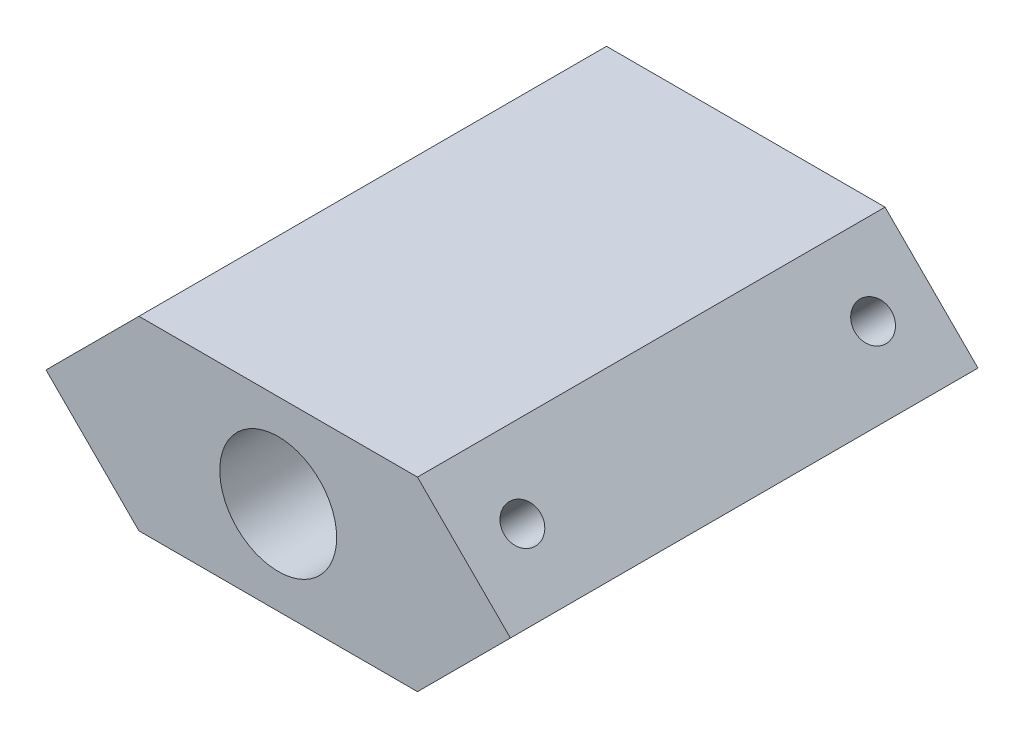
ISO-10303-21;
HEADER;
FILE_DESCRIPTION(('STEP AP214'),'2;1');
FILE_NAME('part.step','',(''),(''),'','','');
FILE_SCHEMA(('AUTOMOTIVE_DESIGN { 1 0 10303 214 1 1 1 1 }'));
ENDSEC;
DATA;
#1=APPLICATION_CONTEXT('core data for automotive mechanical design processes');
#2=APPLICATION_PROTOCOL_DEFINITION('international standard','automotive_design',2000,#1);
#3=PRODUCT_CONTEXT('',#1,'mechanical');
#4=PRODUCT('Part','Part','',(#3));
#5=PRODUCT_RELATED_PRODUCT_CATEGORY('part','',(#4));
#6=PRODUCT_DEFINITION_FORMATION('','',#4);
#7=PRODUCT_DEFINITION_CONTEXT('part definition',#1,'design');
#8=PRODUCT_DEFINITION('design','',#6,#7);
#9=PRODUCT_DEFINITION_SHAPE('','',#8);
#10=(LENGTH_UNIT() NAMED_UNIT(*) SI_UNIT(.MILLI.,.METRE.));
#11=(NAMED_UNIT(*) PLANE_ANGLE_UNIT() SI_UNIT($,.RADIAN.));
#12=(NAMED_UNIT(*) SI_UNIT($,.STERADIAN.) SOLID_ANGLE_UNIT());
#13=UNCERTAINTY_MEASURE_WITH_UNIT(LENGTH_MEASURE(1.E-05),#10,'distance_accuracy_value','');
#14=(GEOMETRIC_REPRESENTATION_CONTEXT(3) GLOBAL_UNCERTAINTY_ASSIGNED_CONTEXT((#13)) GLOBAL_UNIT_ASSIGNED_CONTEXT((#10,
#11,#12)) REPRESENTATION_CONTEXT('',''));
#15=CARTESIAN_POINT('',(0.,0.,0.));
#16=DIRECTION('',(0.,0.,1.));
#17=DIRECTION('',(1.,0.,0.));
#18=AXIS2_PLACEMENT_3D('',#15,#16,#17);
#19=CARTESIAN_POINT('',(50.455,20.193,101.6));
#20=DIRECTION('',(0.,0.,-1.));
#21=DIRECTION('',(-1.,0.,0.));
#22=AXIS2_PLACEMENT_3D('',#19,#20,#21);
#23=CYLINDRICAL_SURFACE('',#22,6.35);
#24=CARTESIAN_POINT('',(50.455,20.193,7.35));
#25=DIRECTION('',(0.,0.,-1.));
#26=DIRECTION('',(-1.,0.,0.));
#27=AXIS2_PLACEMENT_3D('',#24,#25,#26);
#28=CIRCLE('',#27,6.35);
#29=CARTESIAN_POINT('',(44.105,20.193,7.35));
#30=VERTEX_POINT('',#29);
#31=EDGE_CURVE('E136',#30,#30,#28,.F.);
#32=ORIENTED_EDGE('',*,*,#31,.F.);
#33=EDGE_LOOP('',(#32));
#34=FACE_BOUND('',#33,.T.);
#35=CARTESIAN_POINT('',(50.455,20.193,80.95));
#36=DIRECTION('',(0.,0.,1.));
#37=DIRECTION('',(1.,0.,0.));
#38=AXIS2_PLACEMENT_3D('',#35,#36,#37);
#39=CIRCLE('',#38,6.35);
#40=CARTESIAN_POINT('',(56.805,20.193,80.95));
#41=VERTEX_POINT('',#40);
#42=EDGE_CURVE('E36',#41,#41,#39,.F.);
#43=ORIENTED_EDGE('',*,*,#42,.F.);
#44=EDGE_LOOP('',(#43));
#45=FACE_BOUND('',#44,.T.);
#46=ADVANCED_FACE('F32',(#34,#45),#23,.F.);
#47=CARTESIAN_POINT('',(0.,0.,101.6));
#48=DIRECTION('',(0.,1.,0.));
#49=DIRECTION('',(0.,0.,1.));
#50=AXIS2_PLACEMENT_3D('',#47,#48,#49);
#51=PLANE('',#50);
#52=DIRECTION('',(1.,0.,0.));
#53=VECTOR('',#52,1.);
#54=CARTESIAN_POINT('',(0.,0.,101.6));
#55=LINE('',#54,#53);
#56=CARTESIAN_POINT('',(20.193,0.,101.6));
#57=VERTEX_POINT('',#56);
#58=CARTESIAN_POINT('',(80.717,0.,101.6));
#59=VERTEX_POINT('',#58);
#60=EDGE_CURVE('E41',#57,#59,#55,.T.);
#61=ORIENTED_EDGE('',*,*,#60,.F.);
#62=DIRECTION('',(0.,0.,-1.));
#63=VECTOR('',#62,1.);
#64=CARTESIAN_POINT('',(20.193,0.,101.6));
#65=LINE('',#64,#63);
#66=CARTESIAN_POINT('',(20.193,0.,0.));
#67=VERTEX_POINT('',#66);
#68=EDGE_CURVE('E123',#57,#67,#65,.T.);
#69=ORIENTED_EDGE('',*,*,#68,.T.);
#70=DIRECTION('',(1.,0.,0.));
#71=VECTOR('',#70,1.);
#72=CARTESIAN_POINT('',(0.,0.,0.));
#73=LINE('',#72,#71);
#74=CARTESIAN_POINT('',(80.717,0.,0.));
#75=VERTEX_POINT('',#74);
#76=EDGE_CURVE('E57',#67,#75,#73,.T.);
#77=ORIENTED_EDGE('',*,*,#76,.T.);
#78=DIRECTION('',(0.,0.,-1.));
#79=VECTOR('',#78,1.);
#80=CARTESIAN_POINT('',(80.717,0.,101.6));
#81=LINE('',#80,#79);
#82=EDGE_CURVE('E128',#59,#75,#81,.T.);
#83=ORIENTED_EDGE('',*,*,#82,.F.);
#84=EDGE_LOOP('',(#61,#69,#77,#83));
#85=FACE_BOUND('',#84,.T.);
#86=ADVANCED_FACE('F34',(#85),#51,.F.);
#87=CARTESIAN_POINT('',(0.,40.386,101.6));
#88=DIRECTION('',(0.,-1.,0.));
#89=DIRECTION('',(0.,0.,-1.));
#90=AXIS2_PLACEMENT_3D('',#87,#88,#89);
#91=PLANE('',#90);
#92=DIRECTION('',(-1.,0.,0.));
#93=VECTOR('',#92,1.);
#94=CARTESIAN_POINT('',(0.,40.386,0.));
#95=LINE('',#94,#93);
#96=CARTESIAN_POINT('',(80.717,40.386,0.));
#97=VERTEX_POINT('',#96);
#98=CARTESIAN_POINT('',(20.1929999999999,40.386,0.));
#99=VERTEX_POINT('',#98);
#100=EDGE_CURVE('E102',#97,#99,#95,.T.);
#101=ORIENTED_EDGE('',*,*,#100,.T.);
#102=DIRECTION('',(0.,0.,-1.));
#103=VECTOR('',#102,1.);
#104=CARTESIAN_POINT('',(20.1929999999999,40.386,101.6));
#105=LINE('',#104,#103);
#106=CARTESIAN_POINT('',(20.1929999999999,40.386,101.6));
#107=VERTEX_POINT('',#106);
#108=EDGE_CURVE('E90',#107,#99,#105,.T.);
#109=ORIENTED_EDGE('',*,*,#108,.F.);
#110=DIRECTION('',(-1.,0.,0.));
#111=VECTOR('',#110,1.);
#112=CARTESIAN_POINT('',(0.,40.386,101.6));
#113=LINE('',#112,#111);
#114=CARTESIAN_POINT('',(80.717,40.386,101.6));
#115=VERTEX_POINT('',#114);
#116=EDGE_CURVE('E11',#115,#107,#113,.T.);
#117=ORIENTED_EDGE('',*,*,#116,.F.);
#118=DIRECTION('',(0.,0.,-1.));
#119=VECTOR('',#118,1.);
#120=CARTESIAN_POINT('',(80.717,40.386,101.6));
#121=LINE('',#120,#119);
#122=EDGE_CURVE('E113',#115,#97,#121,.T.);
#123=ORIENTED_EDGE('',*,*,#122,.T.);
#124=EDGE_LOOP('',(#101,#109,#117,#123));
#125=FACE_BOUND('',#124,.T.);
#126=ADVANCED_FACE('F99',(#125),#91,.F.);
#127=CARTESIAN_POINT('',(0.,40.386,101.6));
#128=DIRECTION('',(0.,0.,-1.));
#129=DIRECTION('',(-1.,0.,0.));
#130=AXIS2_PLACEMENT_3D('',#127,#128,#129);
#131=PLANE('',#130);
#132=CARTESIAN_POINT('',(50.455,20.193,101.6));
#133=DIRECTION('',(0.,0.,1.));
#134=DIRECTION('',(1.,0.,0.));
#135=AXIS2_PLACEMENT_3D('',#132,#133,#134);
#136=CIRCLE('',#135,12.7);
#137=CARTESIAN_POINT('',(63.155,20.193,101.6));
#138=VERTEX_POINT('',#137);
#139=EDGE_CURVE('E153',#138,#138,#136,.T.);
#140=ORIENTED_EDGE('',*,*,#139,.F.);
#141=EDGE_LOOP('',(#140));
#142=FACE_BOUND('',#141,.T.);
#143=ORIENTED_EDGE('',*,*,#116,.T.);
#144=DIRECTION('',(-0.707106781186546,-0.707106781186549,0.));
#145=VECTOR('',#144,1.);
#146=CARTESIAN_POINT('',(0.,20.193,101.6));
#147=LINE('',#146,#145);
#148=CARTESIAN_POINT('',(0.,20.193,101.6));
#149=VERTEX_POINT('',#148);
#150=EDGE_CURVE('E87',#107,#149,#147,.T.);
#151=ORIENTED_EDGE('',*,*,#150,.T.);
#152=DIRECTION('',(0.707106781186548,-0.707106781186547,0.));
#153=VECTOR('',#152,1.);
#154=CARTESIAN_POINT('',(0.,20.193,101.6));
#155=LINE('',#154,#153);
#156=EDGE_CURVE('E120',#149,#57,#155,.T.);
#157=ORIENTED_EDGE('',*,*,#156,.T.);
#158=ORIENTED_EDGE('',*,*,#60,.T.);
#159=DIRECTION('',(0.707106781186547,0.707106781186548,0.));
#160=VECTOR('',#159,1.);
#161=CARTESIAN_POINT('',(100.91,20.193,101.6));
#162=LINE('',#161,#160);
#163=CARTESIAN_POINT('',(100.91,20.193,101.6));
#164=VERTEX_POINT('',#163);
#165=EDGE_CURVE('E110',#59,#164,#162,.T.);
#166=ORIENTED_EDGE('',*,*,#165,.T.);
#167=DIRECTION('',(-0.707106781186548,0.707106781186547,0.));
#168=VECTOR('',#167,1.);
#169=CARTESIAN_POINT('',(100.91,20.193,101.6));
#170=LINE('',#169,#168);
#171=EDGE_CURVE('E108',#164,#115,#170,.T.);
#172=ORIENTED_EDGE('',*,*,#171,.T.);
#173=EDGE_LOOP('',(#143,#151,#157,#158,#166,#172));
#174=FACE_BOUND('',#173,.T.);
#175=ADVANCED_FACE('F106',(#142,#174),#131,.F.);
#176=CARTESIAN_POINT('',(0.,40.386,0.));
#177=DIRECTION('',(0.,0.,-1.));
#178=DIRECTION('',(-1.,0.,0.));
#179=AXIS2_PLACEMENT_3D('',#176,#177,#178);
#180=PLANE('',#179);
#181=CARTESIAN_POINT('',(50.455,20.193,0.));
#182=DIRECTION('',(0.,0.,-1.));
#183=DIRECTION('',(-1.,0.,0.));
#184=AXIS2_PLACEMENT_3D('',#181,#182,#183);
#185=CIRCLE('',#184,9.525);
#186=CARTESIAN_POINT('',(40.93,20.193,0.));
#187=VERTEX_POINT('',#186);
#188=EDGE_CURVE('E146',#187,#187,#185,.T.);
#189=ORIENTED_EDGE('',*,*,#188,.F.);
#190=EDGE_LOOP('',(#189));
#191=FACE_BOUND('',#190,.T.);
#192=DIRECTION('',(-0.707106781186546,-0.707106781186549,0.));
#193=VECTOR('',#192,1.);
#194=CARTESIAN_POINT('',(0.,20.193,0.));
#195=LINE('',#194,#193);
#196=CARTESIAN_POINT('',(0.,20.193,0.));
#197=VERTEX_POINT('',#196);
#198=EDGE_CURVE('E49',#99,#197,#195,.T.);
#199=ORIENTED_EDGE('',*,*,#198,.F.);
#200=ORIENTED_EDGE('',*,*,#100,.F.);
#201=DIRECTION('',(-0.707106781186548,0.707106781186547,0.));
#202=VECTOR('',#201,1.);
#203=CARTESIAN_POINT('',(100.91,20.193,0.));
#204=LINE('',#203,#202);
#205=CARTESIAN_POINT('',(100.91,20.193,0.));
#206=VERTEX_POINT('',#205);
#207=EDGE_CURVE('E103',#206,#97,#204,.T.);
#208=ORIENTED_EDGE('',*,*,#207,.F.);
#209=DIRECTION('',(0.707106781186547,0.707106781186548,0.));
#210=VECTOR('',#209,1.);
#211=CARTESIAN_POINT('',(100.91,20.193,0.));
#212=LINE('',#211,#210);
#213=EDGE_CURVE('E125',#75,#206,#212,.T.);
#214=ORIENTED_EDGE('',*,*,#213,.F.);
#215=ORIENTED_EDGE('',*,*,#76,.F.);
#216=DIRECTION('',(0.707106781186548,-0.707106781186547,0.));
#217=VECTOR('',#216,1.);
#218=CARTESIAN_POINT('',(0.,20.193,0.));
#219=LINE('',#218,#217);
#220=EDGE_CURVE('E115',#197,#67,#219,.T.);
#221=ORIENTED_EDGE('',*,*,#220,.F.);
#222=EDGE_LOOP('',(#199,#200,#208,#214,#215,#221));
#223=FACE_BOUND('',#222,.T.);
#224=ADVANCED_FACE('F211',(#191,#223),#180,.T.);
#225=CARTESIAN_POINT('',(100.91,20.193,101.6));
#226=DIRECTION('',(-0.707106781186548,0.707106781186547,0.));
#227=DIRECTION('',(-0.707106781186547,-0.707106781186548,0.));
#228=AXIS2_PLACEMENT_3D('',#225,#226,#227);
#229=PLANE('',#228);
#230=CARTESIAN_POINT('',(90.8135,10.0964999999999,31.75));
#231=DIRECTION('',(0.707106781186547,-0.707106781186548,0.));
#232=DIRECTION('',(0.707106781186548,0.707106781186547,0.));
#233=AXIS2_PLACEMENT_3D('',#230,#231,#232);
#234=CIRCLE('',#233,3.937);
#235=CARTESIAN_POINT('',(93.5973793975314,12.8803793975314,31.75));
#236=VERTEX_POINT('',#235);
#237=EDGE_CURVE('E138',#236,#236,#234,.T.);
#238=ORIENTED_EDGE('',*,*,#237,.F.);
#239=EDGE_LOOP('',(#238));
#240=FACE_BOUND('',#239,.T.);
#241=CARTESIAN_POINT('',(90.8135,10.0965,69.85));
#242=DIRECTION('',(0.707106781186547,-0.707106781186548,0.));
#243=DIRECTION('',(0.707106781186548,0.707106781186547,0.));
#244=AXIS2_PLACEMENT_3D('',#241,#242,#243);
#245=CIRCLE('',#244,3.937);
#246=CARTESIAN_POINT('',(93.5973793975315,12.8803793975314,69.85));
#247=VERTEX_POINT('',#246);
#248=EDGE_CURVE('E157',#247,#247,#245,.T.);
#249=ORIENTED_EDGE('',*,*,#248,.F.);
#250=EDGE_LOOP('',(#249));
#251=FACE_BOUND('',#250,.T.);
#252=ORIENTED_EDGE('',*,*,#213,.T.);
#253=DIRECTION('',(0.,0.,-1.));
#254=VECTOR('',#253,1.);
#255=CARTESIAN_POINT('',(100.91,20.193,101.6));
#256=LINE('',#255,#254);
#257=EDGE_CURVE('E131',#164,#206,#256,.T.);
#258=ORIENTED_EDGE('',*,*,#257,.F.);
#259=ORIENTED_EDGE('',*,*,#165,.F.);
#260=ORIENTED_EDGE('',*,*,#82,.T.);
#261=EDGE_LOOP('',(#252,#258,#259,#260));
#262=FACE_BOUND('',#261,.T.);
#263=ADVANCED_FACE('F216',(#240,#251,#262),#229,.F.);
#264=CARTESIAN_POINT('',(0.,20.193,101.6));
#265=DIRECTION('',(0.707106781186547,0.707106781186548,0.));
#266=DIRECTION('',(-0.707106781186548,0.707106781186547,0.));
#267=AXIS2_PLACEMENT_3D('',#264,#265,#266);
#268=PLANE('',#267);
#269=CARTESIAN_POINT('',(10.0965,10.0965,88.9));
#270=DIRECTION('',(-0.707106781186547,-0.707106781186548,0.));
#271=DIRECTION('',(0.707106781186548,-0.707106781186547,0.));
#272=AXIS2_PLACEMENT_3D('',#269,#270,#271);
#273=CIRCLE('',#272,3.937);
#274=CARTESIAN_POINT('',(12.8803793975314,7.31262060246857,88.9));
#275=VERTEX_POINT('',#274);
#276=EDGE_CURVE('E174',#275,#275,#273,.T.);
#277=ORIENTED_EDGE('',*,*,#276,.F.);
#278=EDGE_LOOP('',(#277));
#279=FACE_BOUND('',#278,.T.);
#280=CARTESIAN_POINT('',(10.0965,10.0965,12.7));
#281=DIRECTION('',(-0.707106781186547,-0.707106781186548,0.));
#282=DIRECTION('',(0.707106781186548,-0.707106781186547,0.));
#283=AXIS2_PLACEMENT_3D('',#280,#281,#282);
#284=CIRCLE('',#283,3.937);
#285=CARTESIAN_POINT('',(12.8803793975314,7.31262060246856,12.7));
#286=VERTEX_POINT('',#285);
#287=EDGE_CURVE('E180',#286,#286,#284,.T.);
#288=ORIENTED_EDGE('',*,*,#287,.F.);
#289=EDGE_LOOP('',(#288));
#290=FACE_BOUND('',#289,.T.);
#291=ORIENTED_EDGE('',*,*,#220,.T.);
#292=ORIENTED_EDGE('',*,*,#68,.F.);
#293=ORIENTED_EDGE('',*,*,#156,.F.);
#294=DIRECTION('',(0.,0.,-1.));
#295=VECTOR('',#294,1.);
#296=CARTESIAN_POINT('',(0.,20.193,101.6));
#297=LINE('',#296,#295);
#298=EDGE_CURVE('E91',#149,#197,#297,.T.);
#299=ORIENTED_EDGE('',*,*,#298,.T.);
#300=EDGE_LOOP('',(#291,#292,#293,#299));
#301=FACE_BOUND('',#300,.T.);
#302=ADVANCED_FACE('F205',(#279,#290,#301),#268,.F.);
#303=CARTESIAN_POINT('',(100.91,20.193,101.6));
#304=DIRECTION('',(-0.707106781186547,-0.707106781186548,0.));
#305=DIRECTION('',(0.707106781186548,-0.707106781186547,0.));
#306=AXIS2_PLACEMENT_3D('',#303,#304,#305);
#307=PLANE('',#306);
#308=CARTESIAN_POINT('',(90.8134999999999,30.2895,12.7));
#309=DIRECTION('',(0.707106781186549,0.707106781186546,0.));
#310=DIRECTION('',(-0.707106781186546,0.707106781186549,0.));
#311=AXIS2_PLACEMENT_3D('',#308,#309,#310);
#312=CIRCLE('',#311,3.975);
#313=CARTESIAN_POINT('',(88.0027505447834,33.1002494552165,12.7));
#314=VERTEX_POINT('',#313);
#315=EDGE_CURVE('E186',#314,#314,#312,.T.);
#316=ORIENTED_EDGE('',*,*,#315,.F.);
#317=EDGE_LOOP('',(#316));
#318=FACE_BOUND('',#317,.T.);
#319=CARTESIAN_POINT('',(90.8134999999999,30.2894999999999,88.9));
#320=DIRECTION('',(0.707106781186549,0.707106781186546,0.));
#321=DIRECTION('',(-0.707106781186546,0.707106781186549,0.));
#322=AXIS2_PLACEMENT_3D('',#319,#320,#321);
#323=CIRCLE('',#322,3.97500000000001);
#324=CARTESIAN_POINT('',(88.0027505447834,33.1002494552165,88.9));
#325=VERTEX_POINT('',#324);
#326=EDGE_CURVE('E192',#325,#325,#323,.T.);
#327=ORIENTED_EDGE('',*,*,#326,.F.);
#328=EDGE_LOOP('',(#327));
#329=FACE_BOUND('',#328,.T.);
#330=ORIENTED_EDGE('',*,*,#207,.T.);
#331=ORIENTED_EDGE('',*,*,#122,.F.);
#332=ORIENTED_EDGE('',*,*,#171,.F.);
#333=ORIENTED_EDGE('',*,*,#257,.T.);
#334=EDGE_LOOP('',(#330,#331,#332,#333));
#335=FACE_BOUND('',#334,.T.);
#336=ADVANCED_FACE('F203',(#318,#329,#335),#307,.F.);
#337=CARTESIAN_POINT('',(0.,20.193,101.6));
#338=DIRECTION('',(0.707106781186549,-0.707106781186546,0.));
#339=DIRECTION('',(0.707106781186546,0.707106781186549,0.));
#340=AXIS2_PLACEMENT_3D('',#337,#338,#339);
#341=PLANE('',#340);
#342=CARTESIAN_POINT('',(10.0965,30.2895,69.85));
#343=DIRECTION('',(-0.707106781186549,0.707106781186546,0.));
#344=DIRECTION('',(-0.707106781186546,-0.707106781186549,0.));
#345=AXIS2_PLACEMENT_3D('',#342,#343,#344);
#346=CIRCLE('',#345,3.937);
#347=CARTESIAN_POINT('',(7.31262060246854,27.5056206024686,69.85));
#348=VERTEX_POINT('',#347);
#349=EDGE_CURVE('E162',#348,#348,#346,.T.);
#350=ORIENTED_EDGE('',*,*,#349,.F.);
#351=EDGE_LOOP('',(#350));
#352=FACE_BOUND('',#351,.T.);
#353=CARTESIAN_POINT('',(10.0965,30.2895,31.75));
#354=DIRECTION('',(-0.707106781186549,0.707106781186546,0.));
#355=DIRECTION('',(-0.707106781186546,-0.707106781186549,0.));
#356=AXIS2_PLACEMENT_3D('',#353,#354,#355);
#357=CIRCLE('',#356,3.937);
#358=CARTESIAN_POINT('',(7.31262060246853,27.5056206024686,31.75));
#359=VERTEX_POINT('',#358);
#360=EDGE_CURVE('E168',#359,#359,#357,.T.);
#361=ORIENTED_EDGE('',*,*,#360,.F.);
#362=EDGE_LOOP('',(#361));
#363=FACE_BOUND('',#362,.T.);
#364=ORIENTED_EDGE('',*,*,#198,.T.);
#365=ORIENTED_EDGE('',*,*,#298,.F.);
#366=ORIENTED_EDGE('',*,*,#150,.F.);
#367=ORIENTED_EDGE('',*,*,#108,.T.);
#368=EDGE_LOOP('',(#364,#365,#366,#367));
#369=FACE_BOUND('',#368,.T.);
#370=ADVANCED_FACE('F89',(#352,#363,#369),#341,.F.);
#371=CARTESIAN_POINT('',(76.671364376269,16.147364376269,88.9));
#372=DIRECTION('',(0.707106781186549,0.707106781186546,0.));
#373=DIRECTION('',(-0.707106781186546,0.707106781186549,0.));
#374=AXIS2_PLACEMENT_3D('',#371,#372,#373);
#375=CYLINDRICAL_SURFACE('',#374,3.97500000000001);
#376=CARTESIAN_POINT('',(76.671364376269,16.147364376269,88.9));
#377=DIRECTION('',(0.707106781186549,0.707106781186546,0.));
#378=DIRECTION('',(-0.707106781186546,0.707106781186549,0.));
#379=AXIS2_PLACEMENT_3D('',#376,#377,#378);
#380=CIRCLE('',#379,3.97500000000001);
#381=CARTESIAN_POINT('',(73.8606149210524,18.9581138314856,88.9));
#382=VERTEX_POINT('',#381);
#383=EDGE_CURVE('E195',#382,#382,#380,.T.);
#384=ORIENTED_EDGE('',*,*,#383,.F.);
#385=EDGE_LOOP('',(#384));
#386=FACE_BOUND('',#385,.T.);
#387=ORIENTED_EDGE('',*,*,#326,.T.);
#388=EDGE_LOOP('',(#387));
#389=FACE_BOUND('',#388,.T.);
#390=ADVANCED_FACE('F201',(#386,#389),#375,.F.);
#391=CARTESIAN_POINT('',(76.671364376269,16.147364376269,88.9));
#392=DIRECTION('',(0.707106781186549,0.707106781186546,0.));
#393=DIRECTION('',(-0.707106781186546,0.707106781186549,0.));
#394=AXIS2_PLACEMENT_3D('',#391,#392,#393);
#395=PLANE('',#394);
#396=ORIENTED_EDGE('',*,*,#383,.T.);
#397=EDGE_LOOP('',(#396));
#398=FACE_BOUND('',#397,.T.);
#399=ADVANCED_FACE('F298',(#398),#395,.T.);
#400=CARTESIAN_POINT('',(76.671364376269,16.147364376269,12.7));
#401=DIRECTION('',(0.707106781186549,0.707106781186546,0.));
#402=DIRECTION('',(-0.707106781186546,0.707106781186549,0.));
#403=AXIS2_PLACEMENT_3D('',#400,#401,#402);
#404=CYLINDRICAL_SURFACE('',#403,3.975);
#405=CARTESIAN_POINT('',(76.671364376269,16.147364376269,12.7));
#406=DIRECTION('',(0.707106781186549,0.707106781186546,0.));
#407=DIRECTION('',(-0.707106781186546,0.707106781186549,0.));
#408=AXIS2_PLACEMENT_3D('',#405,#406,#407);
#409=CIRCLE('',#408,3.975);
#410=CARTESIAN_POINT('',(73.8606149210524,18.9581138314856,12.7));
#411=VERTEX_POINT('',#410);
#412=EDGE_CURVE('E189',#411,#411,#409,.T.);
#413=ORIENTED_EDGE('',*,*,#412,.F.);
#414=EDGE_LOOP('',(#413));
#415=FACE_BOUND('',#414,.T.);
#416=ORIENTED_EDGE('',*,*,#315,.T.);
#417=EDGE_LOOP('',(#416));
#418=FACE_BOUND('',#417,.T.);
#419=ADVANCED_FACE('F294',(#415,#418),#404,.F.);
#420=CARTESIAN_POINT('',(76.671364376269,16.147364376269,12.7));
#421=DIRECTION('',(0.707106781186549,0.707106781186546,0.));
#422=DIRECTION('',(-0.707106781186546,0.707106781186549,0.));
#423=AXIS2_PLACEMENT_3D('',#420,#421,#422);
#424=PLANE('',#423);
#425=ORIENTED_EDGE('',*,*,#412,.T.);
#426=EDGE_LOOP('',(#425));
#427=FACE_BOUND('',#426,.T.);
#428=ADVANCED_FACE('F290',(#427),#424,.T.);
#429=CARTESIAN_POINT('',(24.2386356237309,24.2386356237309,12.7));
#430=DIRECTION('',(-0.707106781186547,-0.707106781186548,0.));
#431=DIRECTION('',(0.707106781186548,-0.707106781186547,0.));
#432=AXIS2_PLACEMENT_3D('',#429,#430,#431);
#433=CYLINDRICAL_SURFACE('',#432,3.937);
#434=CARTESIAN_POINT('',(24.2386356237309,24.2386356237309,12.7));
#435=DIRECTION('',(-0.707106781186547,-0.707106781186548,0.));
#436=DIRECTION('',(0.707106781186548,-0.707106781186547,0.));
#437=AXIS2_PLACEMENT_3D('',#434,#435,#436);
#438=CIRCLE('',#437,3.937);
#439=CARTESIAN_POINT('',(27.0225150212624,21.4547562261995,12.7));
#440=VERTEX_POINT('',#439);
#441=EDGE_CURVE('E183',#440,#440,#438,.T.);
#442=ORIENTED_EDGE('',*,*,#441,.F.);
#443=EDGE_LOOP('',(#442));
#444=FACE_BOUND('',#443,.T.);
#445=ORIENTED_EDGE('',*,*,#287,.T.);
#446=EDGE_LOOP('',(#445));
#447=FACE_BOUND('',#446,.T.);
#448=ADVANCED_FACE('F286',(#444,#447),#433,.F.);
#449=CARTESIAN_POINT('',(24.2386356237309,24.2386356237309,12.7));
#450=DIRECTION('',(-0.707106781186547,-0.707106781186548,0.));
#451=DIRECTION('',(0.707106781186548,-0.707106781186547,0.));
#452=AXIS2_PLACEMENT_3D('',#449,#450,#451);
#453=PLANE('',#452);
#454=ORIENTED_EDGE('',*,*,#441,.T.);
#455=EDGE_LOOP('',(#454));
#456=FACE_BOUND('',#455,.T.);
#457=ADVANCED_FACE('F282',(#456),#453,.T.);
#458=CARTESIAN_POINT('',(24.2386356237309,24.238635623731,88.9));
#459=DIRECTION('',(-0.707106781186547,-0.707106781186548,0.));
#460=DIRECTION('',(0.707106781186548,-0.707106781186547,0.));
#461=AXIS2_PLACEMENT_3D('',#458,#459,#460);
#462=CYLINDRICAL_SURFACE('',#461,3.937);
#463=CARTESIAN_POINT('',(24.2386356237309,24.238635623731,88.9));
#464=DIRECTION('',(-0.707106781186547,-0.707106781186548,0.));
#465=DIRECTION('',(0.707106781186548,-0.707106781186547,0.));
#466=AXIS2_PLACEMENT_3D('',#463,#464,#465);
#467=CIRCLE('',#466,3.937);
#468=CARTESIAN_POINT('',(27.0225150212624,21.4547562261995,88.9));
#469=VERTEX_POINT('',#468);
#470=EDGE_CURVE('E177',#469,#469,#467,.T.);
#471=ORIENTED_EDGE('',*,*,#470,.F.);
#472=EDGE_LOOP('',(#471));
#473=FACE_BOUND('',#472,.T.);
#474=ORIENTED_EDGE('',*,*,#276,.T.);
#475=EDGE_LOOP('',(#474));
#476=FACE_BOUND('',#475,.T.);
#477=ADVANCED_FACE('F278',(#473,#476),#462,.F.);
#478=CARTESIAN_POINT('',(24.2386356237309,24.238635623731,88.9));
#479=DIRECTION('',(-0.707106781186547,-0.707106781186548,0.));
#480=DIRECTION('',(0.707106781186548,-0.707106781186547,0.));
#481=AXIS2_PLACEMENT_3D('',#478,#479,#480);
#482=PLANE('',#481);
#483=ORIENTED_EDGE('',*,*,#470,.T.);
#484=EDGE_LOOP('',(#483));
#485=FACE_BOUND('',#484,.T.);
#486=ADVANCED_FACE('F274',(#485),#482,.T.);
#487=CARTESIAN_POINT('',(24.2386356237309,16.1473643762691,31.75));
#488=DIRECTION('',(-0.707106781186549,0.707106781186546,0.));
#489=DIRECTION('',(-0.707106781186546,-0.707106781186549,0.));
#490=AXIS2_PLACEMENT_3D('',#487,#488,#489);
#491=CYLINDRICAL_SURFACE('',#490,3.937);
#492=CARTESIAN_POINT('',(24.2386356237309,16.1473643762691,31.75));
#493=DIRECTION('',(-0.707106781186549,0.707106781186546,0.));
#494=DIRECTION('',(-0.707106781186546,-0.707106781186549,0.));
#495=AXIS2_PLACEMENT_3D('',#492,#493,#494);
#496=CIRCLE('',#495,3.937);
#497=CARTESIAN_POINT('',(21.4547562261995,13.3634849787376,31.75));
#498=VERTEX_POINT('',#497);
#499=EDGE_CURVE('E171',#498,#498,#496,.T.);
#500=ORIENTED_EDGE('',*,*,#499,.F.);
#501=EDGE_LOOP('',(#500));
#502=FACE_BOUND('',#501,.T.);
#503=ORIENTED_EDGE('',*,*,#360,.T.);
#504=EDGE_LOOP('',(#503));
#505=FACE_BOUND('',#504,.T.);
#506=ADVANCED_FACE('F270',(#502,#505),#491,.F.);
#507=CARTESIAN_POINT('',(24.2386356237309,16.1473643762691,31.75));
#508=DIRECTION('',(-0.707106781186549,0.707106781186546,0.));
#509=DIRECTION('',(-0.707106781186546,-0.707106781186549,0.));
#510=AXIS2_PLACEMENT_3D('',#507,#508,#509);
#511=PLANE('',#510);
#512=ORIENTED_EDGE('',*,*,#499,.T.);
#513=EDGE_LOOP('',(#512));
#514=FACE_BOUND('',#513,.T.);
#515=ADVANCED_FACE('F266',(#514),#511,.T.);
#516=CARTESIAN_POINT('',(24.2386356237309,16.1473643762691,69.85));
#517=DIRECTION('',(-0.707106781186549,0.707106781186546,0.));
#518=DIRECTION('',(-0.707106781186546,-0.707106781186549,0.));
#519=AXIS2_PLACEMENT_3D('',#516,#517,#518);
#520=CYLINDRICAL_SURFACE('',#519,3.937);
#521=CARTESIAN_POINT('',(24.2386356237309,16.1473643762691,69.85));
#522=DIRECTION('',(-0.707106781186549,0.707106781186546,0.));
#523=DIRECTION('',(-0.707106781186546,-0.707106781186549,0.));
#524=AXIS2_PLACEMENT_3D('',#521,#522,#523);
#525=CIRCLE('',#524,3.937);
#526=CARTESIAN_POINT('',(21.4547562261995,13.3634849787376,69.85));
#527=VERTEX_POINT('',#526);
#528=EDGE_CURVE('E165',#527,#527,#525,.T.);
#529=ORIENTED_EDGE('',*,*,#528,.F.);
#530=EDGE_LOOP('',(#529));
#531=FACE_BOUND('',#530,.T.);
#532=ORIENTED_EDGE('',*,*,#349,.T.);
#533=EDGE_LOOP('',(#532));
#534=FACE_BOUND('',#533,.T.);
#535=ADVANCED_FACE('F262',(#531,#534),#520,.F.);
#536=CARTESIAN_POINT('',(24.2386356237309,16.1473643762691,69.85));
#537=DIRECTION('',(-0.707106781186549,0.707106781186546,0.));
#538=DIRECTION('',(-0.707106781186546,-0.707106781186549,0.));
#539=AXIS2_PLACEMENT_3D('',#536,#537,#538);
#540=PLANE('',#539);
#541=ORIENTED_EDGE('',*,*,#528,.T.);
#542=EDGE_LOOP('',(#541));
#543=FACE_BOUND('',#542,.T.);
#544=ADVANCED_FACE('F258',(#543),#540,.T.);
#545=CARTESIAN_POINT('',(76.6713643762691,24.2386356237309,69.85));
#546=DIRECTION('',(0.707106781186547,-0.707106781186548,0.));
#547=DIRECTION('',(0.707106781186548,0.707106781186547,0.));
#548=AXIS2_PLACEMENT_3D('',#545,#546,#547);
#549=CYLINDRICAL_SURFACE('',#548,3.937);
#550=CARTESIAN_POINT('',(76.6713643762691,24.2386356237309,69.85));
#551=DIRECTION('',(0.707106781186547,-0.707106781186548,0.));
#552=DIRECTION('',(0.707106781186548,0.707106781186547,0.));
#553=AXIS2_PLACEMENT_3D('',#550,#551,#552);
#554=CIRCLE('',#553,3.937);
#555=CARTESIAN_POINT('',(79.4552437738005,27.0225150212624,69.85));
#556=VERTEX_POINT('',#555);
#557=EDGE_CURVE('E159',#556,#556,#554,.T.);
#558=ORIENTED_EDGE('',*,*,#557,.F.);
#559=EDGE_LOOP('',(#558));
#560=FACE_BOUND('',#559,.T.);
#561=ORIENTED_EDGE('',*,*,#248,.T.);
#562=EDGE_LOOP('',(#561));
#563=FACE_BOUND('',#562,.T.);
#564=ADVANCED_FACE('F254',(#560,#563),#549,.F.);
#565=CARTESIAN_POINT('',(76.6713643762691,24.2386356237309,69.85));
#566=DIRECTION('',(0.707106781186547,-0.707106781186548,0.));
#567=DIRECTION('',(0.707106781186548,0.707106781186547,0.));
#568=AXIS2_PLACEMENT_3D('',#565,#566,#567);
#569=PLANE('',#568);
#570=ORIENTED_EDGE('',*,*,#557,.T.);
#571=EDGE_LOOP('',(#570));
#572=FACE_BOUND('',#571,.T.);
#573=ADVANCED_FACE('F250',(#572),#569,.T.);
#574=CARTESIAN_POINT('',(76.671364376269,24.2386356237309,31.75));
#575=DIRECTION('',(0.707106781186547,-0.707106781186548,0.));
#576=DIRECTION('',(0.707106781186548,0.707106781186547,0.));
#577=AXIS2_PLACEMENT_3D('',#574,#575,#576);
#578=CYLINDRICAL_SURFACE('',#577,3.937);
#579=CARTESIAN_POINT('',(76.671364376269,24.2386356237309,31.75));
#580=DIRECTION('',(0.707106781186547,-0.707106781186548,0.));
#581=DIRECTION('',(0.707106781186548,0.707106781186547,0.));
#582=AXIS2_PLACEMENT_3D('',#579,#580,#581);
#583=CIRCLE('',#582,3.937);
#584=CARTESIAN_POINT('',(79.4552437738005,27.0225150212623,31.75));
#585=VERTEX_POINT('',#584);
#586=EDGE_CURVE('E143',#585,#585,#583,.T.);
#587=ORIENTED_EDGE('',*,*,#586,.F.);
#588=EDGE_LOOP('',(#587));
#589=FACE_BOUND('',#588,.T.);
#590=ORIENTED_EDGE('',*,*,#237,.T.);
#591=EDGE_LOOP('',(#590));
#592=FACE_BOUND('',#591,.T.);
#593=ADVANCED_FACE('F246',(#589,#592),#578,.F.);
#594=CARTESIAN_POINT('',(76.671364376269,24.2386356237309,31.75));
#595=DIRECTION('',(0.707106781186547,-0.707106781186548,0.));
#596=DIRECTION('',(0.707106781186548,0.707106781186547,0.));
#597=AXIS2_PLACEMENT_3D('',#594,#595,#596);
#598=PLANE('',#597);
#599=ORIENTED_EDGE('',*,*,#586,.T.);
#600=EDGE_LOOP('',(#599));
#601=FACE_BOUND('',#600,.T.);
#602=ADVANCED_FACE('F242',(#601),#598,.T.);
#603=CARTESIAN_POINT('',(50.455,20.193,7.35));
#604=DIRECTION('',(0.,0.,-1.));
#605=DIRECTION('',(-1.,0.,0.));
#606=AXIS2_PLACEMENT_3D('',#603,#604,#605);
#607=PLANE('',#606);
#608=CARTESIAN_POINT('',(50.455,20.193,7.35));
#609=DIRECTION('',(0.,0.,-1.));
#610=DIRECTION('',(-1.,0.,0.));
#611=AXIS2_PLACEMENT_3D('',#608,#609,#610);
#612=CIRCLE('',#611,9.525);
#613=CARTESIAN_POINT('',(40.93,20.193,7.35));
#614=VERTEX_POINT('',#613);
#615=EDGE_CURVE('E139',#614,#614,#612,.T.);
#616=ORIENTED_EDGE('',*,*,#615,.T.);
#617=EDGE_LOOP('',(#616));
#618=FACE_BOUND('',#617,.T.);
#619=ORIENTED_EDGE('',*,*,#31,.T.);
#620=EDGE_LOOP('',(#619));
#621=FACE_BOUND('',#620,.T.);
#622=ADVANCED_FACE('F245',(#618,#621),#607,.T.);
#623=CARTESIAN_POINT('',(50.455,20.193,7.35));
#624=DIRECTION('',(0.,0.,-1.));
#625=DIRECTION('',(-1.,0.,0.));
#626=AXIS2_PLACEMENT_3D('',#623,#624,#625);
#627=CYLINDRICAL_SURFACE('',#626,9.525);
#628=ORIENTED_EDGE('',*,*,#615,.F.);
#629=EDGE_LOOP('',(#628));
#630=FACE_BOUND('',#629,.T.);
#631=ORIENTED_EDGE('',*,*,#188,.T.);
#632=EDGE_LOOP('',(#631));
#633=FACE_BOUND('',#632,.T.);
#634=ADVANCED_FACE('F240',(#630,#633),#627,.F.);
#635=CARTESIAN_POINT('',(50.455,20.193,80.95));
#636=DIRECTION('',(0.,0.,1.));
#637=DIRECTION('',(1.,0.,0.));
#638=AXIS2_PLACEMENT_3D('',#635,#636,#637);
#639=PLANE('',#638);
#640=CARTESIAN_POINT('',(50.455,20.193,80.95));
#641=DIRECTION('',(0.,0.,1.));
#642=DIRECTION('',(1.,0.,0.));
#643=AXIS2_PLACEMENT_3D('',#640,#641,#642);
#644=CIRCLE('',#643,12.7);
#645=CARTESIAN_POINT('',(63.155,20.193,80.95));
#646=VERTEX_POINT('',#645);
#647=EDGE_CURVE('E499',#646,#646,#644,.T.);
#648=ORIENTED_EDGE('',*,*,#647,.T.);
#649=EDGE_LOOP('',(#648));
#650=FACE_BOUND('',#649,.T.);
#651=ORIENTED_EDGE('',*,*,#42,.T.);
#652=EDGE_LOOP('',(#651));
#653=FACE_BOUND('',#652,.T.);
#654=ADVANCED_FACE('F394',(#650,#653),#639,.T.);
#655=CARTESIAN_POINT('',(50.455,20.193,80.95));
#656=DIRECTION('',(0.,0.,1.));
#657=DIRECTION('',(1.,0.,0.));
#658=AXIS2_PLACEMENT_3D('',#655,#656,#657);
#659=CYLINDRICAL_SURFACE('',#658,12.7);
#660=CARTESIAN_POINT('',(63.155,20.193,80.95));
#661=CARTESIAN_POINT('',(63.155,20.193,81.1651041666667));
#662=CARTESIAN_POINT('',(63.155,20.193,81.3802083333333));
#663=CARTESIAN_POINT('',(63.155,20.193,81.8104166666667));
#664=CARTESIAN_POINT('',(63.155,20.193,82.0255208333333));
#665=CARTESIAN_POINT('',(63.155,20.193,82.4557291666667));
#666=CARTESIAN_POINT('',(63.155,20.193,82.6708333333333));
#667=CARTESIAN_POINT('',(63.155,20.193,83.1010416666666));
#668=CARTESIAN_POINT('',(63.155,20.193,83.3161458333333));
#669=CARTESIAN_POINT('',(63.155,20.193,83.7463541666666));
#670=CARTESIAN_POINT('',(63.155,20.193,83.9614583333333));
#671=CARTESIAN_POINT('',(63.155,20.193,84.3916666666667));
#672=CARTESIAN_POINT('',(63.155,20.193,84.6067708333333));
#673=CARTESIAN_POINT('',(63.155,20.193,85.0369791666667));
#674=CARTESIAN_POINT('',(63.155,20.193,85.2520833333333));
#675=CARTESIAN_POINT('',(63.155,20.193,85.6822916666666));
#676=CARTESIAN_POINT('',(63.155,20.193,85.8973958333333));
#677=CARTESIAN_POINT('',(63.155,20.193,86.3276041666667));
#678=CARTESIAN_POINT('',(63.155,20.193,86.5427083333333));
#679=CARTESIAN_POINT('',(63.155,20.193,86.9729166666666));
#680=CARTESIAN_POINT('',(63.155,20.193,87.1880208333333));
#681=CARTESIAN_POINT('',(63.155,20.193,87.6182291666667));
#682=CARTESIAN_POINT('',(63.155,20.193,87.8333333333333));
#683=CARTESIAN_POINT('',(63.155,20.193,88.2635416666667));
#684=CARTESIAN_POINT('',(63.155,20.193,88.4786458333333));
#685=CARTESIAN_POINT('',(63.155,20.193,88.9088541666666));
#686=CARTESIAN_POINT('',(63.155,20.193,89.1239583333333));
#687=CARTESIAN_POINT('',(63.155,20.193,89.5541666666667));
#688=CARTESIAN_POINT('',(63.155,20.193,89.7692708333333));
#689=CARTESIAN_POINT('',(63.155,20.193,90.1994791666666));
#690=CARTESIAN_POINT('',(63.155,20.193,90.4145833333333));
#691=CARTESIAN_POINT('',(63.155,20.193,90.8447916666667));
#692=CARTESIAN_POINT('',(63.155,20.193,91.0598958333333));
#693=CARTESIAN_POINT('',(63.155,20.193,91.4901041666667));
#694=CARTESIAN_POINT('',(63.155,20.193,91.7052083333333));
#695=CARTESIAN_POINT('',(63.155,20.193,92.1354166666667));
#696=CARTESIAN_POINT('',(63.155,20.193,92.3505208333333));
#697=CARTESIAN_POINT('',(63.155,20.193,92.7807291666666));
#698=CARTESIAN_POINT('',(63.155,20.193,92.9958333333333));
#699=CARTESIAN_POINT('',(63.155,20.193,93.4260416666666));
#700=CARTESIAN_POINT('',(63.155,20.193,93.6411458333333));
#701=CARTESIAN_POINT('',(63.155,20.193,94.0713541666667));
#702=CARTESIAN_POINT('',(63.155,20.193,94.2864583333333));
#703=CARTESIAN_POINT('',(63.155,20.193,94.7166666666667));
#704=CARTESIAN_POINT('',(63.155,20.193,94.9317708333333));
#705=CARTESIAN_POINT('',(63.155,20.193,95.3619791666667));
#706=CARTESIAN_POINT('',(63.155,20.193,95.5770833333333));
#707=CARTESIAN_POINT('',(63.155,20.193,96.0072916666666));
#708=CARTESIAN_POINT('',(63.155,20.193,96.2223958333333));
#709=CARTESIAN_POINT('',(63.155,20.193,96.6526041666667));
#710=CARTESIAN_POINT('',(63.155,20.193,96.8677083333333));
#711=CARTESIAN_POINT('',(63.155,20.193,97.2979166666667));
#712=CARTESIAN_POINT('',(63.155,20.193,97.5130208333333));
#713=CARTESIAN_POINT('',(63.155,20.193,97.9432291666666));
#714=CARTESIAN_POINT('',(63.155,20.193,98.1583333333333));
#715=CARTESIAN_POINT('',(63.155,20.193,98.5885416666667));
#716=CARTESIAN_POINT('',(63.155,20.193,98.8036458333333));
#717=CARTESIAN_POINT('',(63.155,20.193,99.2338541666666));
#718=CARTESIAN_POINT('',(63.155,20.193,99.4489583333333));
#719=CARTESIAN_POINT('',(63.155,20.193,99.8791666666666));
#720=CARTESIAN_POINT('',(63.155,20.193,100.094270833333));
#721=CARTESIAN_POINT('',(63.155,20.193,100.524479166667));
#722=CARTESIAN_POINT('',(63.155,20.193,100.739583333333));
#723=CARTESIAN_POINT('',(63.155,20.193,101.169791666667));
#724=CARTESIAN_POINT('',(63.155,20.193,101.384895833333));
#725=CARTESIAN_POINT('',(63.155,20.193,101.6));
#726=B_SPLINE_CURVE_WITH_KNOTS('',3,(#660,#661,#662,#663,#664,#665,#666,#667,#668,#669,#670,
#671,#672,#673,#674,#675,#676,#677,#678,#679,#680,#681,#682,#683,#684,#685,#686,#687,#688,#689,
#690,#691,#692,#693,#694,#695,#696,#697,#698,#699,#700,#701,#702,#703,#704,#705,#706,#707,#708,
#709,#710,#711,#712,#713,#714,#715,#716,#717,#718,#719,#720,#721,#722,#723,#724,#725),
.UNSPECIFIED.,.F.,.F.,(4,2,2,2,2,2,2,2,2,2,2,2,2,2,2,2,2,2,2,2,2,2,2,2,2,2,2,2,2,2,2,2,4),(0.,
0.645312499999995,1.29062499999999,1.9359375,2.58124999999999,3.22656249999999,3.871875,
4.51718749999999,5.16249999999999,5.8078125,6.45312499999999,7.0984375,7.74374999999999,
8.38906249999999,9.034375,9.67968749999999,10.325,10.9703125,11.615625,12.2609375,12.90625,
13.5515625,14.196875,14.8421875,15.4875,16.1328125,16.778125,17.4234375,18.06875,18.7140625,
19.359375,20.0046875,20.65),.UNSPECIFIED.);
#727=EDGE_CURVE('BSEAM401',#646,#138,#726,.T.);
#728=ORIENTED_EDGE('',*,*,#647,.F.);
#729=ORIENTED_EDGE('',*,*,#139,.T.);
#730=ORIENTED_EDGE('',*,*,#727,.T.);
#731=ORIENTED_EDGE('',*,*,#727,.F.);
#732=EDGE_LOOP('',(#728,#730,#729,#731));
#733=FACE_BOUND('',#732,.T.);
#734=ADVANCED_FACE('F401',(#733),#659,.F.);
#735=CLOSED_SHELL('',(#46,#86,#126,#175,#224,#263,#302,#336,#370,#390,#399,#419,#428,#448,#457,
#477,#486,#506,#515,#535,#544,#564,#573,#593,#602,#622,#634,#654,#734));
#736=MANIFOLD_SOLID_BREP('B2',#735);
#737=ADVANCED_BREP_SHAPE_REPRESENTATION('',(#18,#736),#14);
#738=SHAPE_DEFINITION_REPRESENTATION(#9,#737);
ENDSEC;
END-ISO-10303-21;
